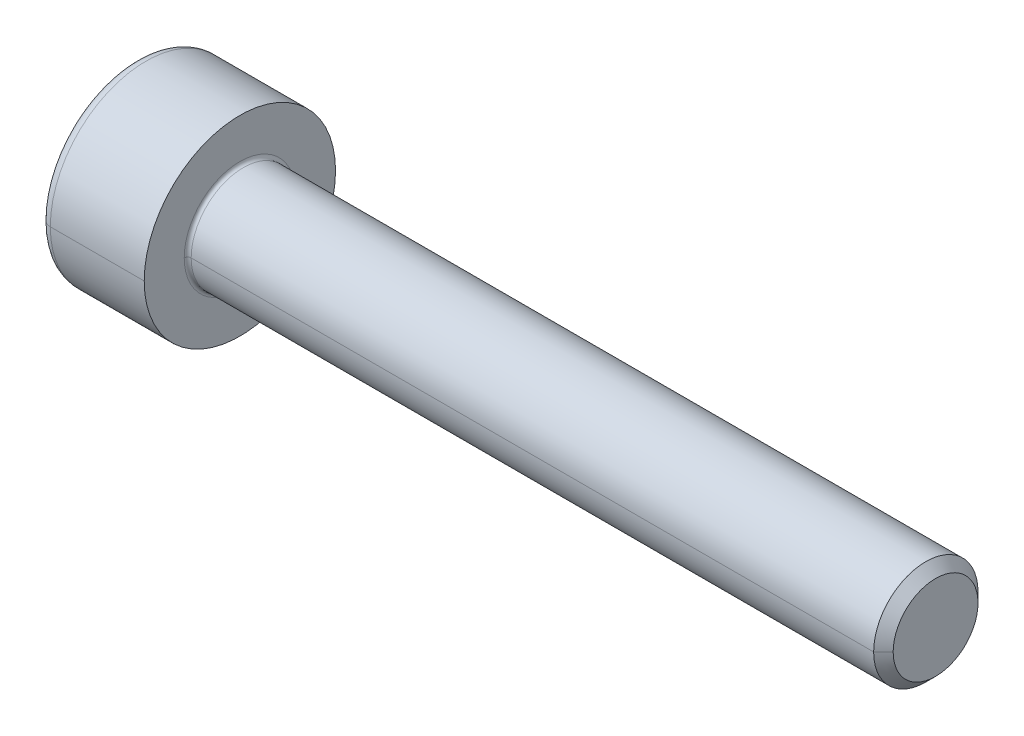
ISO-10303-21;
HEADER;
FILE_DESCRIPTION(('STEP AP214'),'2;1');
FILE_NAME('part.step','',(''),(''),'','','');
FILE_SCHEMA(('AUTOMOTIVE_DESIGN { 1 0 10303 214 1 1 1 1 }'));
ENDSEC;
DATA;
#1=APPLICATION_CONTEXT('core data for automotive mechanical design processes');
#2=APPLICATION_PROTOCOL_DEFINITION('international standard','automotive_design',2000,#1);
#3=PRODUCT_CONTEXT('',#1,'mechanical');
#4=PRODUCT('Part','Part','',(#3));
#5=PRODUCT_RELATED_PRODUCT_CATEGORY('part','',(#4));
#6=PRODUCT_DEFINITION_FORMATION('','',#4);
#7=PRODUCT_DEFINITION_CONTEXT('part definition',#1,'design');
#8=PRODUCT_DEFINITION('design','',#6,#7);
#9=PRODUCT_DEFINITION_SHAPE('','',#8);
#10=(LENGTH_UNIT() NAMED_UNIT(*) SI_UNIT(.MILLI.,.METRE.));
#11=(NAMED_UNIT(*) PLANE_ANGLE_UNIT() SI_UNIT($,.RADIAN.));
#12=(NAMED_UNIT(*) SI_UNIT($,.STERADIAN.) SOLID_ANGLE_UNIT());
#13=UNCERTAINTY_MEASURE_WITH_UNIT(LENGTH_MEASURE(1.E-05),#10,'distance_accuracy_value','');
#14=(GEOMETRIC_REPRESENTATION_CONTEXT(3) GLOBAL_UNCERTAINTY_ASSIGNED_CONTEXT((#13)) GLOBAL_UNIT_ASSIGNED_CONTEXT((#10,
#11,#12)) REPRESENTATION_CONTEXT('',''));
#15=CARTESIAN_POINT('',(0.,0.,0.));
#16=DIRECTION('',(0.,0.,1.));
#17=DIRECTION('',(1.,0.,0.));
#18=AXIS2_PLACEMENT_3D('',#15,#16,#17);
#19=CARTESIAN_POINT('',(1.3,0.,0.));
#20=DIRECTION('',(-1.,0.,0.));
#21=DIRECTION('',(0.,0.,1.));
#22=AXIS2_PLACEMENT_3D('',#19,#20,#21);
#23=CONICAL_SURFACE('',#22,1.26,1.0471975511966);
#24=DIRECTION('',(-0.5,0.,-0.866025403784436));
#25=VECTOR('',#24,1.);
#26=CARTESIAN_POINT('',(1.3,0.,-1.26));
#27=LINE('',#26,#25);
#28=CARTESIAN_POINT('',(2.02746133917893,0.,0.));
#29=VERTEX_POINT('',#28);
#30=CARTESIAN_POINT('',(1.3,0.,-1.26));
#31=VERTEX_POINT('',#30);
#32=EDGE_CURVE('E395',#29,#31,#27,.T.);
#33=ORIENTED_EDGE('',*,*,#32,.F.);
#34=DIRECTION('',(-0.5,0.,0.866025403784436));
#35=VECTOR('',#34,1.);
#36=CARTESIAN_POINT('',(1.3,0.,1.26));
#37=LINE('',#36,#35);
#38=CARTESIAN_POINT('',(1.3,0.,1.26));
#39=VERTEX_POINT('',#38);
#40=EDGE_CURVE('E401',#29,#39,#37,.T.);
#41=ORIENTED_EDGE('',*,*,#40,.T.);
#42=CARTESIAN_POINT('',(1.3,0.,0.));
#43=DIRECTION('',(-1.,0.,0.));
#44=DIRECTION('',(0.,0.,1.));
#45=AXIS2_PLACEMENT_3D('',#42,#43,#44);
#46=CIRCLE('',#45,1.26);
#47=CARTESIAN_POINT('',(1.3,1.09119200876839,0.63));
#48=VERTEX_POINT('',#47);
#49=EDGE_CURVE('E327',#39,#48,#46,.T.);
#50=ORIENTED_EDGE('',*,*,#49,.T.);
#51=CARTESIAN_POINT('',(1.3,0.,0.));
#52=DIRECTION('',(-1.,0.,0.));
#53=DIRECTION('',(0.,0.,1.));
#54=AXIS2_PLACEMENT_3D('',#51,#52,#53);
#55=CIRCLE('',#54,1.26);
#56=CARTESIAN_POINT('',(1.3,1.09119200876839,-0.63));
#57=VERTEX_POINT('',#56);
#58=EDGE_CURVE('E27',#48,#57,#55,.T.);
#59=ORIENTED_EDGE('',*,*,#58,.T.);
#60=CARTESIAN_POINT('',(1.3,0.,0.));
#61=DIRECTION('',(-1.,0.,0.));
#62=DIRECTION('',(0.,0.,1.));
#63=AXIS2_PLACEMENT_3D('',#60,#61,#62);
#64=CIRCLE('',#63,1.26);
#65=EDGE_CURVE('E11',#57,#31,#64,.T.);
#66=ORIENTED_EDGE('',*,*,#65,.T.);
#67=EDGE_LOOP('',(#33,#41,#50,#59,#66));
#68=FACE_BOUND('',#67,.T.);
#69=ADVANCED_FACE('F17',(#68),#23,.F.);
#70=CARTESIAN_POINT('',(1.3,2.18238401753678,-1.26));
#71=DIRECTION('',(1.,0.,0.));
#72=DIRECTION('',(0.,1.,0.));
#73=AXIS2_PLACEMENT_3D('',#70,#71,#72);
#74=PLANE('',#73);
#75=DIRECTION('',(0.,-0.5,-0.866025403784438));
#76=VECTOR('',#75,1.);
#77=CARTESIAN_POINT('',(1.3,1.45492267835785,0.));
#78=LINE('',#77,#76);
#79=CARTESIAN_POINT('',(1.3,0.727461339178921,-1.26));
#80=VERTEX_POINT('',#79);
#81=EDGE_CURVE('E247',#57,#80,#78,.T.);
#82=ORIENTED_EDGE('',*,*,#81,.T.);
#83=DIRECTION('',(0.,-1.,0.));
#84=VECTOR('',#83,1.);
#85=CARTESIAN_POINT('',(1.3,0.727461339178921,-1.26));
#86=LINE('',#85,#84);
#87=EDGE_CURVE('E248',#80,#31,#86,.T.);
#88=ORIENTED_EDGE('',*,*,#87,.T.);
#89=ORIENTED_EDGE('',*,*,#65,.F.);
#90=EDGE_LOOP('',(#82,#88,#89));
#91=FACE_BOUND('',#90,.T.);
#92=ADVANCED_FACE('F19',(#91),#74,.F.);
#93=CARTESIAN_POINT('',(1.3,2.18238401753678,-1.26));
#94=DIRECTION('',(1.,0.,0.));
#95=DIRECTION('',(0.,1.,0.));
#96=AXIS2_PLACEMENT_3D('',#93,#94,#95);
#97=PLANE('',#96);
#98=DIRECTION('',(0.,-0.5,0.86602540378444));
#99=VECTOR('',#98,1.);
#100=CARTESIAN_POINT('',(1.3,1.45492267835785,0.));
#101=LINE('',#100,#99);
#102=CARTESIAN_POINT('',(1.3,1.45492267835785,0.));
#103=VERTEX_POINT('',#102);
#104=EDGE_CURVE('E337',#103,#48,#101,.T.);
#105=ORIENTED_EDGE('',*,*,#104,.F.);
#106=DIRECTION('',(0.,-0.5,-0.866025403784438));
#107=VECTOR('',#106,1.);
#108=CARTESIAN_POINT('',(1.3,1.45492267835785,0.));
#109=LINE('',#108,#107);
#110=EDGE_CURVE('E331',#103,#57,#109,.T.);
#111=ORIENTED_EDGE('',*,*,#110,.T.);
#112=ORIENTED_EDGE('',*,*,#58,.F.);
#113=EDGE_LOOP('',(#105,#111,#112));
#114=FACE_BOUND('',#113,.T.);
#115=ADVANCED_FACE('F379',(#114),#97,.F.);
#116=CARTESIAN_POINT('',(1.3,2.18238401753678,-1.26));
#117=DIRECTION('',(1.,0.,0.));
#118=DIRECTION('',(0.,1.,0.));
#119=AXIS2_PLACEMENT_3D('',#116,#117,#118);
#120=PLANE('',#119);
#121=DIRECTION('',(0.,1.,0.));
#122=VECTOR('',#121,1.);
#123=CARTESIAN_POINT('',(1.3,-0.727461339178933,1.26));
#124=LINE('',#123,#122);
#125=CARTESIAN_POINT('',(1.3,0.727461339178925,1.26));
#126=VERTEX_POINT('',#125);
#127=EDGE_CURVE('E282',#39,#126,#124,.T.);
#128=ORIENTED_EDGE('',*,*,#127,.T.);
#129=DIRECTION('',(0.,-0.5,0.86602540378444));
#130=VECTOR('',#129,1.);
#131=CARTESIAN_POINT('',(1.3,1.45492267835785,0.));
#132=LINE('',#131,#130);
#133=EDGE_CURVE('E283',#48,#126,#132,.T.);
#134=ORIENTED_EDGE('',*,*,#133,.F.);
#135=ORIENTED_EDGE('',*,*,#49,.F.);
#136=EDGE_LOOP('',(#128,#134,#135));
#137=FACE_BOUND('',#136,.T.);
#138=ADVANCED_FACE('F460',(#137),#120,.F.);
#139=CARTESIAN_POINT('',(1.3,2.18238401753678,-1.26));
#140=DIRECTION('',(1.,0.,0.));
#141=DIRECTION('',(0.,1.,0.));
#142=AXIS2_PLACEMENT_3D('',#139,#140,#141);
#143=PLANE('',#142);
#144=DIRECTION('',(0.,-0.5,-0.866025403784438));
#145=VECTOR('',#144,1.);
#146=CARTESIAN_POINT('',(1.3,-0.727461339178933,1.26));
#147=LINE('',#146,#145);
#148=CARTESIAN_POINT('',(1.3,-0.727461339178933,1.26));
#149=VERTEX_POINT('',#148);
#150=CARTESIAN_POINT('',(1.3,-1.0911920087684,0.63));
#151=VERTEX_POINT('',#150);
#152=EDGE_CURVE('E353',#149,#151,#147,.T.);
#153=ORIENTED_EDGE('',*,*,#152,.F.);
#154=DIRECTION('',(0.,1.,0.));
#155=VECTOR('',#154,1.);
#156=CARTESIAN_POINT('',(1.3,-0.727461339178933,1.26));
#157=LINE('',#156,#155);
#158=EDGE_CURVE('E346',#149,#39,#157,.T.);
#159=ORIENTED_EDGE('',*,*,#158,.T.);
#160=CARTESIAN_POINT('',(1.3,0.,0.));
#161=DIRECTION('',(-1.,0.,0.));
#162=DIRECTION('',(0.,0.,1.));
#163=AXIS2_PLACEMENT_3D('',#160,#161,#162);
#164=CIRCLE('',#163,1.26);
#165=EDGE_CURVE('E416',#151,#39,#164,.T.);
#166=ORIENTED_EDGE('',*,*,#165,.F.);
#167=EDGE_LOOP('',(#153,#159,#166));
#168=FACE_BOUND('',#167,.T.);
#169=ADVANCED_FACE('F466',(#168),#143,.F.);
#170=CARTESIAN_POINT('',(1.3,2.18238401753678,-1.26));
#171=DIRECTION('',(1.,0.,0.));
#172=DIRECTION('',(0.,1.,0.));
#173=AXIS2_PLACEMENT_3D('',#170,#171,#172);
#174=PLANE('',#173);
#175=DIRECTION('',(0.,0.5,-0.86602540378444));
#176=VECTOR('',#175,1.);
#177=CARTESIAN_POINT('',(1.3,-1.45492267835786,0.));
#178=LINE('',#177,#176);
#179=CARTESIAN_POINT('',(1.3,-1.45492267835786,0.));
#180=VERTEX_POINT('',#179);
#181=CARTESIAN_POINT('',(1.3,-1.0911920087684,-0.63));
#182=VERTEX_POINT('',#181);
#183=EDGE_CURVE('E111',#180,#182,#178,.T.);
#184=ORIENTED_EDGE('',*,*,#183,.F.);
#185=DIRECTION('',(0.,-0.5,-0.866025403784438));
#186=VECTOR('',#185,1.);
#187=CARTESIAN_POINT('',(1.3,-0.727461339178933,1.26));
#188=LINE('',#187,#186);
#189=EDGE_CURVE('E259',#151,#180,#188,.T.);
#190=ORIENTED_EDGE('',*,*,#189,.F.);
#191=CARTESIAN_POINT('',(1.3,0.,0.));
#192=DIRECTION('',(-1.,0.,0.));
#193=DIRECTION('',(0.,0.,1.));
#194=AXIS2_PLACEMENT_3D('',#191,#192,#193);
#195=CIRCLE('',#194,1.26);
#196=EDGE_CURVE('E394',#182,#151,#195,.T.);
#197=ORIENTED_EDGE('',*,*,#196,.F.);
#198=EDGE_LOOP('',(#184,#190,#197));
#199=FACE_BOUND('',#198,.T.);
#200=ADVANCED_FACE('F471',(#199),#174,.F.);
#201=CARTESIAN_POINT('',(1.3,2.18238401753678,-1.26));
#202=DIRECTION('',(1.,0.,0.));
#203=DIRECTION('',(0.,1.,0.));
#204=AXIS2_PLACEMENT_3D('',#201,#202,#203);
#205=PLANE('',#204);
#206=DIRECTION('',(0.,-1.,0.));
#207=VECTOR('',#206,1.);
#208=CARTESIAN_POINT('',(1.3,0.727461339178921,-1.26));
#209=LINE('',#208,#207);
#210=CARTESIAN_POINT('',(1.3,-0.727461339178936,-1.26));
#211=VERTEX_POINT('',#210);
#212=EDGE_CURVE('E124',#31,#211,#209,.T.);
#213=ORIENTED_EDGE('',*,*,#212,.T.);
#214=DIRECTION('',(0.,0.5,-0.86602540378444));
#215=VECTOR('',#214,1.);
#216=CARTESIAN_POINT('',(1.3,-1.45492267835786,0.));
#217=LINE('',#216,#215);
#218=EDGE_CURVE('E360',#182,#211,#217,.T.);
#219=ORIENTED_EDGE('',*,*,#218,.F.);
#220=CARTESIAN_POINT('',(1.3,0.,0.));
#221=DIRECTION('',(-1.,0.,0.));
#222=DIRECTION('',(0.,0.,1.));
#223=AXIS2_PLACEMENT_3D('',#220,#221,#222);
#224=CIRCLE('',#223,1.26);
#225=EDGE_CURVE('E388',#31,#182,#224,.T.);
#226=ORIENTED_EDGE('',*,*,#225,.F.);
#227=EDGE_LOOP('',(#213,#219,#226));
#228=FACE_BOUND('',#227,.T.);
#229=ADVANCED_FACE('F390',(#228),#205,.F.);
#230=CARTESIAN_POINT('',(1.3,1.45492267835785,0.));
#231=DIRECTION('',(0.,0.866025403784438,-0.5));
#232=DIRECTION('',(-1.,0.,0.));
#233=AXIS2_PLACEMENT_3D('',#230,#231,#232);
#234=PLANE('',#233);
#235=DIRECTION('',(0.,-0.5,-0.866025403784438));
#236=VECTOR('',#235,1.);
#237=CARTESIAN_POINT('',(0.,1.45492267835785,0.));
#238=LINE('',#237,#236);
#239=CARTESIAN_POINT('',(0.,1.45492267835785,0.));
#240=VERTEX_POINT('',#239);
#241=CARTESIAN_POINT('',(0.,0.727461339178921,-1.26));
#242=VERTEX_POINT('',#241);
#243=EDGE_CURVE('E264',#240,#242,#238,.T.);
#244=ORIENTED_EDGE('',*,*,#243,.T.);
#245=DIRECTION('',(-1.,0.,0.));
#246=VECTOR('',#245,1.);
#247=CARTESIAN_POINT('',(1.3,0.727461339178921,-1.26));
#248=LINE('',#247,#246);
#249=EDGE_CURVE('E244',#80,#242,#248,.T.);
#250=ORIENTED_EDGE('',*,*,#249,.F.);
#251=ORIENTED_EDGE('',*,*,#81,.F.);
#252=ORIENTED_EDGE('',*,*,#110,.F.);
#253=DIRECTION('',(-1.,0.,0.));
#254=VECTOR('',#253,1.);
#255=CARTESIAN_POINT('',(1.3,1.45492267835785,0.));
#256=LINE('',#255,#254);
#257=EDGE_CURVE('E334',#103,#240,#256,.T.);
#258=ORIENTED_EDGE('',*,*,#257,.T.);
#259=EDGE_LOOP('',(#244,#250,#251,#252,#258));
#260=FACE_BOUND('',#259,.T.);
#261=ADVANCED_FACE('F383',(#260),#234,.F.);
#262=CARTESIAN_POINT('',(1.3,0.727461339178921,-1.26));
#263=DIRECTION('',(0.,0.,-1.));
#264=DIRECTION('',(0.,-1.,0.));
#265=AXIS2_PLACEMENT_3D('',#262,#263,#264);
#266=PLANE('',#265);
#267=DIRECTION('',(0.,-1.,0.));
#268=VECTOR('',#267,1.);
#269=CARTESIAN_POINT('',(0.,0.727461339178921,-1.26));
#270=LINE('',#269,#268);
#271=CARTESIAN_POINT('',(0.,-0.727461339178936,-1.26));
#272=VERTEX_POINT('',#271);
#273=EDGE_CURVE('E260',#242,#272,#270,.T.);
#274=ORIENTED_EDGE('',*,*,#273,.T.);
#275=DIRECTION('',(-1.,0.,0.));
#276=VECTOR('',#275,1.);
#277=CARTESIAN_POINT('',(1.3,-0.727461339178936,-1.26));
#278=LINE('',#277,#276);
#279=EDGE_CURVE('E364',#211,#272,#278,.T.);
#280=ORIENTED_EDGE('',*,*,#279,.F.);
#281=ORIENTED_EDGE('',*,*,#212,.F.);
#282=ORIENTED_EDGE('',*,*,#87,.F.);
#283=ORIENTED_EDGE('',*,*,#249,.T.);
#284=EDGE_LOOP('',(#274,#280,#281,#282,#283));
#285=FACE_BOUND('',#284,.T.);
#286=ADVANCED_FACE('F386',(#285),#266,.F.);
#287=CARTESIAN_POINT('',(1.3,-1.45492267835786,0.));
#288=DIRECTION('',(0.,0.86602540378444,0.5));
#289=DIRECTION('',(1.,0.,0.));
#290=AXIS2_PLACEMENT_3D('',#287,#288,#289);
#291=PLANE('',#290);
#292=DIRECTION('',(0.,0.5,-0.86602540378444));
#293=VECTOR('',#292,1.);
#294=CARTESIAN_POINT('',(0.,-1.45492267835786,0.));
#295=LINE('',#294,#293);
#296=CARTESIAN_POINT('',(0.,-1.45492267835786,0.));
#297=VERTEX_POINT('',#296);
#298=EDGE_CURVE('E265',#297,#272,#295,.T.);
#299=ORIENTED_EDGE('',*,*,#298,.F.);
#300=DIRECTION('',(-1.,0.,0.));
#301=VECTOR('',#300,1.);
#302=CARTESIAN_POINT('',(1.3,-1.45492267835786,0.));
#303=LINE('',#302,#301);
#304=EDGE_CURVE('E256',#180,#297,#303,.T.);
#305=ORIENTED_EDGE('',*,*,#304,.F.);
#306=ORIENTED_EDGE('',*,*,#183,.T.);
#307=ORIENTED_EDGE('',*,*,#218,.T.);
#308=ORIENTED_EDGE('',*,*,#279,.T.);
#309=EDGE_LOOP('',(#299,#305,#306,#307,#308));
#310=FACE_BOUND('',#309,.T.);
#311=ADVANCED_FACE('F489',(#310),#291,.T.);
#312=CARTESIAN_POINT('',(1.3,-0.727461339178933,1.26));
#313=DIRECTION('',(0.,0.866025403784438,-0.5));
#314=DIRECTION('',(-1.,0.,0.));
#315=AXIS2_PLACEMENT_3D('',#312,#313,#314);
#316=PLANE('',#315);
#317=DIRECTION('',(0.,-0.5,-0.866025403784438));
#318=VECTOR('',#317,1.);
#319=CARTESIAN_POINT('',(0.,-0.727461339178933,1.26));
#320=LINE('',#319,#318);
#321=CARTESIAN_POINT('',(0.,-0.727461339178933,1.26));
#322=VERTEX_POINT('',#321);
#323=EDGE_CURVE('E307',#322,#297,#320,.T.);
#324=ORIENTED_EDGE('',*,*,#323,.F.);
#325=DIRECTION('',(-1.,0.,0.));
#326=VECTOR('',#325,1.);
#327=CARTESIAN_POINT('',(1.3,-0.727461339178933,1.26));
#328=LINE('',#327,#326);
#329=EDGE_CURVE('E350',#149,#322,#328,.T.);
#330=ORIENTED_EDGE('',*,*,#329,.F.);
#331=ORIENTED_EDGE('',*,*,#152,.T.);
#332=ORIENTED_EDGE('',*,*,#189,.T.);
#333=ORIENTED_EDGE('',*,*,#304,.T.);
#334=EDGE_LOOP('',(#324,#330,#331,#332,#333));
#335=FACE_BOUND('',#334,.T.);
#336=ADVANCED_FACE('F758',(#335),#316,.T.);
#337=CARTESIAN_POINT('',(1.3,-0.727461339178933,1.26));
#338=DIRECTION('',(0.,0.,1.));
#339=DIRECTION('',(0.,-1.,0.));
#340=AXIS2_PLACEMENT_3D('',#337,#338,#339);
#341=PLANE('',#340);
#342=DIRECTION('',(0.,1.,0.));
#343=VECTOR('',#342,1.);
#344=CARTESIAN_POINT('',(0.,-0.727461339178933,1.26));
#345=LINE('',#344,#343);
#346=CARTESIAN_POINT('',(0.,0.727461339178925,1.26));
#347=VERTEX_POINT('',#346);
#348=EDGE_CURVE('E303',#322,#347,#345,.T.);
#349=ORIENTED_EDGE('',*,*,#348,.T.);
#350=DIRECTION('',(-1.,0.,0.));
#351=VECTOR('',#350,1.);
#352=CARTESIAN_POINT('',(1.3,0.727461339178925,1.26));
#353=LINE('',#352,#351);
#354=EDGE_CURVE('E279',#126,#347,#353,.T.);
#355=ORIENTED_EDGE('',*,*,#354,.F.);
#356=ORIENTED_EDGE('',*,*,#127,.F.);
#357=ORIENTED_EDGE('',*,*,#158,.F.);
#358=ORIENTED_EDGE('',*,*,#329,.T.);
#359=EDGE_LOOP('',(#349,#355,#356,#357,#358));
#360=FACE_BOUND('',#359,.T.);
#361=ADVANCED_FACE('F478',(#360),#341,.F.);
#362=CARTESIAN_POINT('',(1.3,1.45492267835785,0.));
#363=DIRECTION('',(0.,-0.86602540378444,-0.5));
#364=DIRECTION('',(0.,0.5,-0.86602540378444));
#365=AXIS2_PLACEMENT_3D('',#362,#363,#364);
#366=PLANE('',#365);
#367=DIRECTION('',(0.,-0.5,0.86602540378444));
#368=VECTOR('',#367,1.);
#369=CARTESIAN_POINT('',(0.,1.45492267835785,0.));
#370=LINE('',#369,#368);
#371=EDGE_CURVE('E208',#240,#347,#370,.T.);
#372=ORIENTED_EDGE('',*,*,#371,.F.);
#373=ORIENTED_EDGE('',*,*,#257,.F.);
#374=ORIENTED_EDGE('',*,*,#104,.T.);
#375=ORIENTED_EDGE('',*,*,#133,.T.);
#376=ORIENTED_EDGE('',*,*,#354,.T.);
#377=EDGE_LOOP('',(#372,#373,#374,#375,#376));
#378=FACE_BOUND('',#377,.T.);
#379=ADVANCED_FACE('F482',(#378),#366,.T.);
#380=CARTESIAN_POINT('',(0.3,0.,0.));
#381=DIRECTION('',(-1.,0.,0.));
#382=DIRECTION('',(0.,0.,1.));
#383=AXIS2_PLACEMENT_3D('',#380,#381,#382);
#384=TOROIDAL_SURFACE('',#383,2.45,0.3);
#385=CARTESIAN_POINT('',(0.3,0.,-2.45));
#386=DIRECTION('',(0.,1.,0.));
#387=DIRECTION('',(0.,0.,1.));
#388=AXIS2_PLACEMENT_3D('',#385,#386,#387);
#389=CIRCLE('',#388,0.3);
#390=CARTESIAN_POINT('',(0.3,0.,-2.75));
#391=VERTEX_POINT('',#390);
#392=CARTESIAN_POINT('',(0.,0.,-2.45));
#393=VERTEX_POINT('',#392);
#394=EDGE_CURVE('E223',#391,#393,#389,.T.);
#395=ORIENTED_EDGE('',*,*,#394,.F.);
#396=CARTESIAN_POINT('',(0.3,0.,0.));
#397=DIRECTION('',(1.,0.,0.));
#398=DIRECTION('',(0.,0.,1.));
#399=AXIS2_PLACEMENT_3D('',#396,#397,#398);
#400=CIRCLE('',#399,2.75);
#401=CARTESIAN_POINT('',(0.3,0.,2.75));
#402=VERTEX_POINT('',#401);
#403=EDGE_CURVE('E214',#402,#391,#400,.T.);
#404=ORIENTED_EDGE('',*,*,#403,.F.);
#405=CARTESIAN_POINT('',(0.3,0.,2.45));
#406=DIRECTION('',(0.,-1.,0.));
#407=DIRECTION('',(0.,0.,-1.));
#408=AXIS2_PLACEMENT_3D('',#405,#406,#407);
#409=CIRCLE('',#408,0.3);
#410=CARTESIAN_POINT('',(0.,0.,2.45));
#411=VERTEX_POINT('',#410);
#412=EDGE_CURVE('E212',#402,#411,#409,.T.);
#413=ORIENTED_EDGE('',*,*,#412,.T.);
#414=CARTESIAN_POINT('',(0.,0.,0.));
#415=DIRECTION('',(-1.,0.,0.));
#416=DIRECTION('',(0.,0.,1.));
#417=AXIS2_PLACEMENT_3D('',#414,#415,#416);
#418=CIRCLE('',#417,2.45);
#419=EDGE_CURVE('E198',#393,#411,#418,.T.);
#420=ORIENTED_EDGE('',*,*,#419,.F.);
#421=EDGE_LOOP('',(#395,#404,#413,#420));
#422=FACE_BOUND('',#421,.T.);
#423=ADVANCED_FACE('F213',(#422),#384,.T.);
#424=CARTESIAN_POINT('',(3.1,0.,0.));
#425=DIRECTION('',(1.,0.,0.));
#426=DIRECTION('',(0.,0.,-1.));
#427=AXIS2_PLACEMENT_3D('',#424,#425,#426);
#428=TOROIDAL_SURFACE('',#427,1.6,0.1);
#429=CARTESIAN_POINT('',(3.1,0.,1.6));
#430=DIRECTION('',(0.,1.,0.));
#431=DIRECTION('',(0.,0.,1.));
#432=AXIS2_PLACEMENT_3D('',#429,#430,#431);
#433=CIRCLE('',#432,0.1);
#434=CARTESIAN_POINT('',(3.1,0.,1.5));
#435=VERTEX_POINT('',#434);
#436=CARTESIAN_POINT('',(3.,0.,1.6));
#437=VERTEX_POINT('',#436);
#438=EDGE_CURVE('E239',#435,#437,#433,.T.);
#439=ORIENTED_EDGE('',*,*,#438,.F.);
#440=CARTESIAN_POINT('',(3.1,0.,0.));
#441=DIRECTION('',(1.,0.,0.));
#442=DIRECTION('',(0.,0.,-1.));
#443=AXIS2_PLACEMENT_3D('',#440,#441,#442);
#444=CIRCLE('',#443,1.5);
#445=CARTESIAN_POINT('',(3.1,0.,-1.5));
#446=VERTEX_POINT('',#445);
#447=EDGE_CURVE('E278',#446,#435,#444,.T.);
#448=ORIENTED_EDGE('',*,*,#447,.F.);
#449=CARTESIAN_POINT('',(3.1,0.,-1.6));
#450=DIRECTION('',(0.,-1.,0.));
#451=DIRECTION('',(0.,0.,-1.));
#452=AXIS2_PLACEMENT_3D('',#449,#450,#451);
#453=CIRCLE('',#452,0.1);
#454=CARTESIAN_POINT('',(3.,0.,-1.6));
#455=VERTEX_POINT('',#454);
#456=EDGE_CURVE('E255',#446,#455,#453,.T.);
#457=ORIENTED_EDGE('',*,*,#456,.T.);
#458=CARTESIAN_POINT('',(3.,0.,0.));
#459=DIRECTION('',(-1.,0.,0.));
#460=DIRECTION('',(0.,0.,-1.));
#461=AXIS2_PLACEMENT_3D('',#458,#459,#460);
#462=CIRCLE('',#461,1.6);
#463=EDGE_CURVE('E148',#437,#455,#462,.T.);
#464=ORIENTED_EDGE('',*,*,#463,.F.);
#465=EDGE_LOOP('',(#439,#448,#457,#464));
#466=FACE_BOUND('',#465,.T.);
#467=ADVANCED_FACE('F430',(#466),#428,.F.);
#468=CARTESIAN_POINT('',(23.,1.2195,0.));
#469=DIRECTION('',(1.,0.,0.));
#470=DIRECTION('',(0.,1.,0.));
#471=AXIS2_PLACEMENT_3D('',#468,#469,#470);
#472=PLANE('',#471);
#473=CARTESIAN_POINT('',(23.,0.,0.));
#474=DIRECTION('',(-1.,0.,0.));
#475=DIRECTION('',(0.,0.,1.));
#476=AXIS2_PLACEMENT_3D('',#473,#474,#475);
#477=CIRCLE('',#476,1.2195);
#478=CARTESIAN_POINT('',(23.,0.,1.2195));
#479=VERTEX_POINT('',#478);
#480=CARTESIAN_POINT('',(23.,0.,-1.2195));
#481=VERTEX_POINT('',#480);
#482=EDGE_CURVE('E238',#479,#481,#477,.T.);
#483=ORIENTED_EDGE('',*,*,#482,.F.);
#484=CARTESIAN_POINT('',(23.,0.,0.));
#485=DIRECTION('',(-1.,0.,0.));
#486=DIRECTION('',(0.,0.,1.));
#487=AXIS2_PLACEMENT_3D('',#484,#485,#486);
#488=CIRCLE('',#487,1.2195);
#489=EDGE_CURVE('E161',#481,#479,#488,.T.);
#490=ORIENTED_EDGE('',*,*,#489,.F.);
#491=EDGE_LOOP('',(#483,#490));
#492=FACE_BOUND('',#491,.T.);
#493=ADVANCED_FACE('F443',(#492),#472,.T.);
#494=CARTESIAN_POINT('',(23.,0.,0.));
#495=DIRECTION('',(-1.,0.,0.));
#496=DIRECTION('',(0.,0.,1.));
#497=AXIS2_PLACEMENT_3D('',#494,#495,#496);
#498=CONICAL_SURFACE('',#497,1.2195,0.785398163397432);
#499=DIRECTION('',(-0.707106781186559,0.,-0.707106781186536));
#500=VECTOR('',#499,1.);
#501=CARTESIAN_POINT('',(23.,0.,-1.2195));
#502=LINE('',#501,#500);
#503=CARTESIAN_POINT('',(22.7195,0.,-1.5));
#504=VERTEX_POINT('',#503);
#505=EDGE_CURVE('E233',#481,#504,#502,.T.);
#506=ORIENTED_EDGE('',*,*,#505,.F.);
#507=ORIENTED_EDGE('',*,*,#489,.T.);
#508=DIRECTION('',(-0.707106781186559,0.,0.707106781186536));
#509=VECTOR('',#508,1.);
#510=CARTESIAN_POINT('',(23.,0.,1.2195));
#511=LINE('',#510,#509);
#512=CARTESIAN_POINT('',(22.7195,0.,1.5));
#513=VERTEX_POINT('',#512);
#514=EDGE_CURVE('E271',#479,#513,#511,.T.);
#515=ORIENTED_EDGE('',*,*,#514,.T.);
#516=CARTESIAN_POINT('',(22.7195,0.,0.));
#517=DIRECTION('',(-1.,0.,0.));
#518=DIRECTION('',(0.,0.,1.));
#519=AXIS2_PLACEMENT_3D('',#516,#517,#518);
#520=CIRCLE('',#519,1.5);
#521=EDGE_CURVE('E324',#504,#513,#520,.T.);
#522=ORIENTED_EDGE('',*,*,#521,.F.);
#523=EDGE_LOOP('',(#506,#507,#515,#522));
#524=FACE_BOUND('',#523,.T.);
#525=ADVANCED_FACE('F438',(#524),#498,.T.);
#526=CARTESIAN_POINT('',(-31.75,0.,0.));
#527=DIRECTION('',(-1.,0.,0.));
#528=DIRECTION('',(0.,0.,1.));
#529=AXIS2_PLACEMENT_3D('',#526,#527,#528);
#530=CYLINDRICAL_SURFACE('',#529,1.5);
#531=DIRECTION('',(-1.,0.,0.));
#532=VECTOR('',#531,1.);
#533=CARTESIAN_POINT('',(-31.75,0.,-1.5));
#534=LINE('',#533,#532);
#535=EDGE_CURVE('E274',#504,#446,#534,.T.);
#536=ORIENTED_EDGE('',*,*,#535,.F.);
#537=ORIENTED_EDGE('',*,*,#521,.T.);
#538=DIRECTION('',(-1.,0.,0.));
#539=VECTOR('',#538,1.);
#540=CARTESIAN_POINT('',(-31.75,0.,1.5));
#541=LINE('',#540,#539);
#542=EDGE_CURVE('E292',#513,#435,#541,.T.);
#543=ORIENTED_EDGE('',*,*,#542,.T.);
#544=CARTESIAN_POINT('',(3.1,0.,0.));
#545=DIRECTION('',(1.,0.,0.));
#546=DIRECTION('',(0.,0.,-1.));
#547=AXIS2_PLACEMENT_3D('',#544,#545,#546);
#548=CIRCLE('',#547,1.5);
#549=EDGE_CURVE('E220',#435,#446,#548,.T.);
#550=ORIENTED_EDGE('',*,*,#549,.T.);
#551=EDGE_LOOP('',(#536,#537,#543,#550));
#552=FACE_BOUND('',#551,.T.);
#553=ADVANCED_FACE('F437',(#552),#530,.T.);
#554=CARTESIAN_POINT('',(3.,2.75,0.));
#555=DIRECTION('',(1.,0.,0.));
#556=DIRECTION('',(0.,1.,0.));
#557=AXIS2_PLACEMENT_3D('',#554,#555,#556);
#558=PLANE('',#557);
#559=CARTESIAN_POINT('',(3.,0.,0.));
#560=DIRECTION('',(-1.,0.,0.));
#561=DIRECTION('',(0.,0.,-1.));
#562=AXIS2_PLACEMENT_3D('',#559,#560,#561);
#563=CIRCLE('',#562,1.6);
#564=EDGE_CURVE('E243',#455,#437,#563,.T.);
#565=ORIENTED_EDGE('',*,*,#564,.T.);
#566=ORIENTED_EDGE('',*,*,#463,.T.);
#567=EDGE_LOOP('',(#565,#566));
#568=FACE_BOUND('',#567,.T.);
#569=CARTESIAN_POINT('',(3.,0.,0.));
#570=DIRECTION('',(-1.,0.,0.));
#571=DIRECTION('',(0.,0.,1.));
#572=AXIS2_PLACEMENT_3D('',#569,#570,#571);
#573=CIRCLE('',#572,2.75);
#574=CARTESIAN_POINT('',(3.,0.,2.75));
#575=VERTEX_POINT('',#574);
#576=CARTESIAN_POINT('',(3.,0.,-2.75));
#577=VERTEX_POINT('',#576);
#578=EDGE_CURVE('E288',#575,#577,#573,.T.);
#579=ORIENTED_EDGE('',*,*,#578,.F.);
#580=CARTESIAN_POINT('',(3.,0.,0.));
#581=DIRECTION('',(-1.,0.,0.));
#582=DIRECTION('',(0.,0.,1.));
#583=AXIS2_PLACEMENT_3D('',#580,#581,#582);
#584=CIRCLE('',#583,2.75);
#585=EDGE_CURVE('E317',#577,#575,#584,.T.);
#586=ORIENTED_EDGE('',*,*,#585,.F.);
#587=EDGE_LOOP('',(#579,#586));
#588=FACE_BOUND('',#587,.T.);
#589=ADVANCED_FACE('F424',(#568,#588),#558,.T.);
#590=CARTESIAN_POINT('',(-31.75,0.,0.));
#591=DIRECTION('',(-1.,0.,0.));
#592=DIRECTION('',(0.,0.,1.));
#593=AXIS2_PLACEMENT_3D('',#590,#591,#592);
#594=CYLINDRICAL_SURFACE('',#593,2.75);
#595=DIRECTION('',(-1.,0.,0.));
#596=VECTOR('',#595,1.);
#597=CARTESIAN_POINT('',(-31.75,0.,-2.75));
#598=LINE('',#597,#596);
#599=EDGE_CURVE('E284',#577,#391,#598,.T.);
#600=ORIENTED_EDGE('',*,*,#599,.F.);
#601=ORIENTED_EDGE('',*,*,#585,.T.);
#602=DIRECTION('',(-1.,0.,0.));
#603=VECTOR('',#602,1.);
#604=CARTESIAN_POINT('',(-31.75,0.,2.75));
#605=LINE('',#604,#603);
#606=EDGE_CURVE('E209',#575,#402,#605,.T.);
#607=ORIENTED_EDGE('',*,*,#606,.T.);
#608=ORIENTED_EDGE('',*,*,#403,.T.);
#609=EDGE_LOOP('',(#600,#601,#607,#608));
#610=FACE_BOUND('',#609,.T.);
#611=ADVANCED_FACE('F705',(#610),#594,.T.);
#612=CARTESIAN_POINT('',(0.,0.,0.));
#613=DIRECTION('',(-1.,0.,0.));
#614=DIRECTION('',(0.,0.,1.));
#615=AXIS2_PLACEMENT_3D('',#612,#613,#614);
#616=PLANE('',#615);
#617=ORIENTED_EDGE('',*,*,#371,.T.);
#618=ORIENTED_EDGE('',*,*,#348,.F.);
#619=ORIENTED_EDGE('',*,*,#323,.T.);
#620=ORIENTED_EDGE('',*,*,#298,.T.);
#621=ORIENTED_EDGE('',*,*,#273,.F.);
#622=ORIENTED_EDGE('',*,*,#243,.F.);
#623=EDGE_LOOP('',(#617,#618,#619,#620,#621,#622));
#624=FACE_BOUND('',#623,.T.);
#625=CARTESIAN_POINT('',(0.,0.,0.));
#626=DIRECTION('',(-1.,0.,0.));
#627=DIRECTION('',(0.,0.,1.));
#628=AXIS2_PLACEMENT_3D('',#625,#626,#627);
#629=CIRCLE('',#628,2.45);
#630=EDGE_CURVE('E205',#411,#393,#629,.T.);
#631=ORIENTED_EDGE('',*,*,#630,.T.);
#632=ORIENTED_EDGE('',*,*,#419,.T.);
#633=EDGE_LOOP('',(#631,#632));
#634=FACE_BOUND('',#633,.T.);
#635=ADVANCED_FACE('F203',(#624,#634),#616,.T.);
#636=CARTESIAN_POINT('',(-31.75,0.,0.));
#637=DIRECTION('',(-1.,0.,0.));
#638=DIRECTION('',(0.,0.,1.));
#639=AXIS2_PLACEMENT_3D('',#636,#637,#638);
#640=CYLINDRICAL_SURFACE('',#639,2.75);
#641=ORIENTED_EDGE('',*,*,#578,.T.);
#642=ORIENTED_EDGE('',*,*,#599,.T.);
#643=CARTESIAN_POINT('',(0.3,0.,0.));
#644=DIRECTION('',(1.,0.,0.));
#645=DIRECTION('',(0.,0.,1.));
#646=AXIS2_PLACEMENT_3D('',#643,#644,#645);
#647=CIRCLE('',#646,2.75);
#648=EDGE_CURVE('E229',#391,#402,#647,.T.);
#649=ORIENTED_EDGE('',*,*,#648,.T.);
#650=ORIENTED_EDGE('',*,*,#606,.F.);
#651=EDGE_LOOP('',(#641,#642,#649,#650));
#652=FACE_BOUND('',#651,.T.);
#653=ADVANCED_FACE('F689',(#652),#640,.T.);
#654=CARTESIAN_POINT('',(-31.75,0.,0.));
#655=DIRECTION('',(-1.,0.,0.));
#656=DIRECTION('',(0.,0.,1.));
#657=AXIS2_PLACEMENT_3D('',#654,#655,#656);
#658=CYLINDRICAL_SURFACE('',#657,1.5);
#659=CARTESIAN_POINT('',(22.7195,0.,0.));
#660=DIRECTION('',(-1.,0.,0.));
#661=DIRECTION('',(0.,0.,1.));
#662=AXIS2_PLACEMENT_3D('',#659,#660,#661);
#663=CIRCLE('',#662,1.5);
#664=EDGE_CURVE('E237',#513,#504,#663,.T.);
#665=ORIENTED_EDGE('',*,*,#664,.T.);
#666=ORIENTED_EDGE('',*,*,#535,.T.);
#667=ORIENTED_EDGE('',*,*,#447,.T.);
#668=ORIENTED_EDGE('',*,*,#542,.F.);
#669=EDGE_LOOP('',(#665,#666,#667,#668));
#670=FACE_BOUND('',#669,.T.);
#671=ADVANCED_FACE('F434',(#670),#658,.T.);
#672=CARTESIAN_POINT('',(23.,0.,0.));
#673=DIRECTION('',(-1.,0.,0.));
#674=DIRECTION('',(0.,0.,1.));
#675=AXIS2_PLACEMENT_3D('',#672,#673,#674);
#676=CONICAL_SURFACE('',#675,1.2195,0.785398163397432);
#677=ORIENTED_EDGE('',*,*,#482,.T.);
#678=ORIENTED_EDGE('',*,*,#505,.T.);
#679=ORIENTED_EDGE('',*,*,#664,.F.);
#680=ORIENTED_EDGE('',*,*,#514,.F.);
#681=EDGE_LOOP('',(#677,#678,#679,#680));
#682=FACE_BOUND('',#681,.T.);
#683=ADVANCED_FACE('F441',(#682),#676,.T.);
#684=CARTESIAN_POINT('',(3.1,0.,0.));
#685=DIRECTION('',(1.,0.,0.));
#686=DIRECTION('',(0.,0.,-1.));
#687=AXIS2_PLACEMENT_3D('',#684,#685,#686);
#688=TOROIDAL_SURFACE('',#687,1.6,0.1);
#689=ORIENTED_EDGE('',*,*,#549,.F.);
#690=ORIENTED_EDGE('',*,*,#438,.T.);
#691=ORIENTED_EDGE('',*,*,#564,.F.);
#692=ORIENTED_EDGE('',*,*,#456,.F.);
#693=EDGE_LOOP('',(#689,#690,#691,#692));
#694=FACE_BOUND('',#693,.T.);
#695=ADVANCED_FACE('F429',(#694),#688,.F.);
#696=CARTESIAN_POINT('',(0.3,0.,0.));
#697=DIRECTION('',(-1.,0.,0.));
#698=DIRECTION('',(0.,0.,1.));
#699=AXIS2_PLACEMENT_3D('',#696,#697,#698);
#700=TOROIDAL_SURFACE('',#699,2.45,0.3);
#701=ORIENTED_EDGE('',*,*,#648,.F.);
#702=ORIENTED_EDGE('',*,*,#394,.T.);
#703=ORIENTED_EDGE('',*,*,#630,.F.);
#704=ORIENTED_EDGE('',*,*,#412,.F.);
#705=EDGE_LOOP('',(#701,#702,#703,#704));
#706=FACE_BOUND('',#705,.T.);
#707=ADVANCED_FACE('F222',(#706),#700,.T.);
#708=CARTESIAN_POINT('',(1.3,0.,0.));
#709=DIRECTION('',(-1.,0.,0.));
#710=DIRECTION('',(0.,0.,1.));
#711=AXIS2_PLACEMENT_3D('',#708,#709,#710);
#712=CONICAL_SURFACE('',#711,1.26,1.0471975511966);
#713=ORIENTED_EDGE('',*,*,#40,.F.);
#714=ORIENTED_EDGE('',*,*,#32,.T.);
#715=ORIENTED_EDGE('',*,*,#225,.T.);
#716=ORIENTED_EDGE('',*,*,#196,.T.);
#717=ORIENTED_EDGE('',*,*,#165,.T.);
#718=EDGE_LOOP('',(#713,#714,#715,#716,#717));
#719=FACE_BOUND('',#718,.T.);
#720=ADVANCED_FACE('F398',(#719),#712,.F.);
#721=CLOSED_SHELL('',(#69,#92,#115,#138,#169,#200,#229,#261,#286,#311,#336,#361,#379,#423,#467,
#493,#525,#553,#589,#611,#635,#653,#671,#683,#695,#707,#720));
#722=MANIFOLD_SOLID_BREP('B1',#721);
#723=ADVANCED_BREP_SHAPE_REPRESENTATION('',(#18,#722),#14);
#724=SHAPE_DEFINITION_REPRESENTATION(#9,#723);
ENDSEC;
END-ISO-10303-21;
